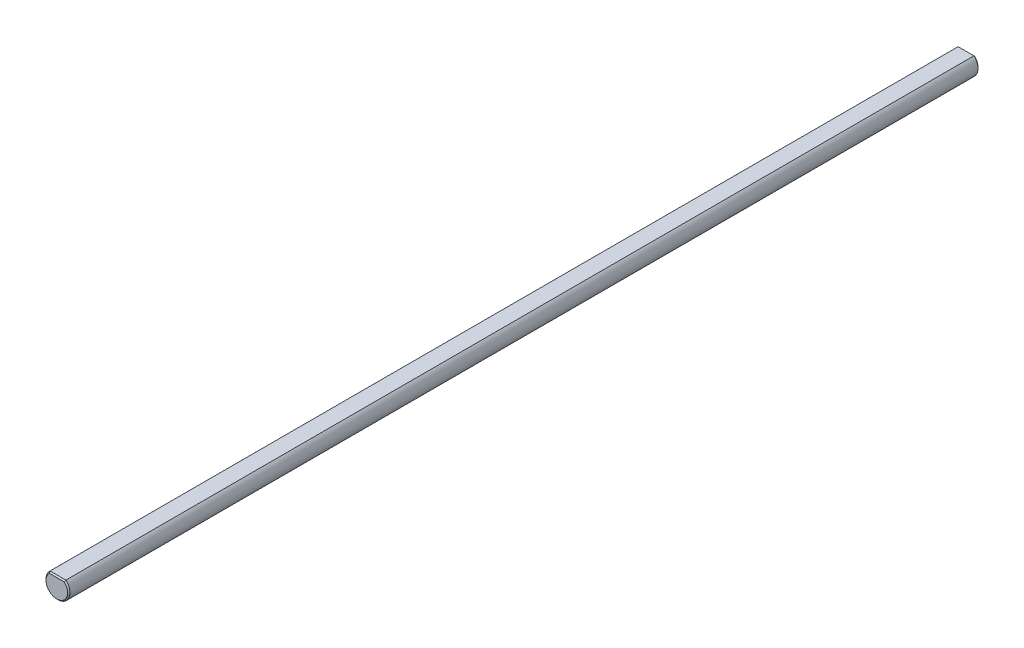
ISO-10303-21;
HEADER;
FILE_DESCRIPTION(('STEP AP214'),'2;1');
FILE_NAME('part.step','',(''),(''),'','','');
FILE_SCHEMA(('AUTOMOTIVE_DESIGN { 1 0 10303 214 1 1 1 1 }'));
ENDSEC;
DATA;
#1=APPLICATION_CONTEXT('core data for automotive mechanical design processes');
#2=APPLICATION_PROTOCOL_DEFINITION('international standard','automotive_design',2000,#1);
#3=PRODUCT_CONTEXT('',#1,'mechanical');
#4=PRODUCT('Part','Part','',(#3));
#5=PRODUCT_RELATED_PRODUCT_CATEGORY('part','',(#4));
#6=PRODUCT_DEFINITION_FORMATION('','',#4);
#7=PRODUCT_DEFINITION_CONTEXT('part definition',#1,'design');
#8=PRODUCT_DEFINITION('design','',#6,#7);
#9=PRODUCT_DEFINITION_SHAPE('','',#8);
#10=(LENGTH_UNIT() NAMED_UNIT(*) SI_UNIT(.MILLI.,.METRE.));
#11=(NAMED_UNIT(*) PLANE_ANGLE_UNIT() SI_UNIT($,.RADIAN.));
#12=(NAMED_UNIT(*) SI_UNIT($,.STERADIAN.) SOLID_ANGLE_UNIT());
#13=UNCERTAINTY_MEASURE_WITH_UNIT(LENGTH_MEASURE(1.E-05),#10,'distance_accuracy_value','');
#14=(GEOMETRIC_REPRESENTATION_CONTEXT(3) GLOBAL_UNCERTAINTY_ASSIGNED_CONTEXT((#13)) GLOBAL_UNIT_ASSIGNED_CONTEXT((#10,
#11,#12)) REPRESENTATION_CONTEXT('',''));
#15=CARTESIAN_POINT('',(0.,0.,0.));
#16=DIRECTION('',(0.,0.,1.));
#17=DIRECTION('',(1.,0.,0.));
#18=AXIS2_PLACEMENT_3D('',#15,#16,#17);
#19=CARTESIAN_POINT('',(0.,1.5,151.8));
#20=DIRECTION('',(0.,-0.707106781186597,-0.707106781186499));
#21=DIRECTION('',(0.,0.707106781186499,-0.707106781186597));
#22=AXIS2_PLACEMENT_3D('',#19,#20,#21);
#23=PLANE('',#22);
#24=CARTESIAN_POINT('',(-1.24498995978677,1.30000000000683,151.999999999993));
#25=CARTESIAN_POINT('',(-1.25833682018426,1.33326211367395,151.966737886326));
#26=CARTESIAN_POINT('',(-1.27150073002902,1.36655985041835,151.933440149582));
#27=CARTESIAN_POINT('',(-1.2974626280238,1.43322651719116,151.866773482809));
#28=CARTESIAN_POINT('',(-1.31026061675417,1.46659544710657,151.833404552893));
#29=CARTESIAN_POINT('',(-1.32287565551219,1.49999999998626,151.800000000014));
#30=B_SPLINE_CURVE_WITH_KNOTS('',3,(#24,#25,#26,#27,#28,#29),.UNSPECIFIED.,.F.,.F.,(4,2,4),(0.,
0.146686412468909,0.293372592276294),.UNSPECIFIED.);
#31=CARTESIAN_POINT('',(-1.24498995979528,1.29999999999835,151.999999999993));
#32=VERTEX_POINT('',#31);
#33=CARTESIAN_POINT('',(-1.32287565551915,1.49999999999443,151.800000000004));
#34=VERTEX_POINT('',#33);
#35=EDGE_CURVE('E62',#32,#34,#30,.T.);
#36=ORIENTED_EDGE('',*,*,#35,.F.);
#37=DIRECTION('',(1.,0.,0.));
#38=VECTOR('',#37,1.);
#39=CARTESIAN_POINT('',(0.,1.29999999999835,152.));
#40=LINE('',#39,#38);
#41=CARTESIAN_POINT('',(1.24498995979579,1.30000000000259,151.99999999999));
#42=VERTEX_POINT('',#41);
#43=EDGE_CURVE('E74',#42,#32,#40,.F.);
#44=ORIENTED_EDGE('',*,*,#43,.F.);
#45=CARTESIAN_POINT('',(1.32287565551172,1.49999999998654,151.800000000013));
#46=CARTESIAN_POINT('',(1.31026061675389,1.46659544710678,151.833404552893));
#47=CARTESIAN_POINT('',(1.29746262802368,1.4332265171913,151.866773482809));
#48=CARTESIAN_POINT('',(1.27150073002919,1.36655985041837,151.933440149582));
#49=CARTESIAN_POINT('',(1.25833682018456,1.33326211367391,151.966737886326));
#50=CARTESIAN_POINT('',(1.24498995978719,1.30000000000674,151.999999999993));
#51=B_SPLINE_CURVE_WITH_KNOTS('',3,(#45,#46,#47,#48,#49,#50),.UNSPECIFIED.,.F.,.F.,(4,2,4),(0.,
0.146686179807521,0.293372592276554),.UNSPECIFIED.);
#52=CARTESIAN_POINT('',(1.32287565552245,1.49999999999307,151.800000000004));
#53=VERTEX_POINT('',#52);
#54=EDGE_CURVE('E21',#53,#42,#51,.T.);
#55=ORIENTED_EDGE('',*,*,#54,.F.);
#56=DIRECTION('',(1.,0.,0.));
#57=VECTOR('',#56,1.);
#58=CARTESIAN_POINT('',(0.,1.5,151.799999999995));
#59=LINE('',#58,#57);
#60=EDGE_CURVE('E72',#34,#53,#59,.T.);
#61=ORIENTED_EDGE('',*,*,#60,.F.);
#62=EDGE_LOOP('',(#36,#44,#55,#61));
#63=FACE_BOUND('',#62,.T.);
#64=ADVANCED_FACE('F17',(#63),#23,.F.);
#65=CARTESIAN_POINT('',(0.,1.30000000000001,0.));
#66=DIRECTION('',(0.,0.707106781186572,-0.707106781186523));
#67=DIRECTION('',(0.,0.707106781186523,0.707106781186572));
#68=AXIS2_PLACEMENT_3D('',#65,#66,#67);
#69=PLANE('',#68);
#70=CARTESIAN_POINT('',(1.24498995980252,1.29999999999865,-1.36273829544672E-12));
#71=CARTESIAN_POINT('',(1.25833682021523,1.33326211366918,0.0332621136691727));
#72=CARTESIAN_POINT('',(1.27150073007549,1.36655985041698,0.0665598504169746));
#73=CARTESIAN_POINT('',(1.29746262810182,1.43322651719657,0.133226517196568));
#74=CARTESIAN_POINT('',(1.31026061684826,1.46659544711535,0.166595447115354));
#75=CARTESIAN_POINT('',(1.3228756556226,1.4999999999984,0.199999999998403));
#76=B_SPLINE_CURVE_WITH_KNOTS('',3,(#70,#71,#72,#73,#74,#75),.UNSPECIFIED.,.F.,.F.,(4,2,4),(0.,
0.146686412495317,0.293372592329109),.UNSPECIFIED.);
#77=CARTESIAN_POINT('',(1.24498995980554,1.2999999999967,-6.81379102545471E-13));
#78=VERTEX_POINT('',#77);
#79=CARTESIAN_POINT('',(1.32287565557843,1.5,0.200000000000644));
#80=VERTEX_POINT('',#79);
#81=EDGE_CURVE('E75',#78,#80,#76,.T.);
#82=ORIENTED_EDGE('',*,*,#81,.F.);
#83=DIRECTION('',(1.,0.,0.));
#84=VECTOR('',#83,1.);
#85=CARTESIAN_POINT('',(0.,1.29999999999476,0.));
#86=LINE('',#85,#84);
#87=CARTESIAN_POINT('',(-1.24498995980554,1.2999999999967,-6.81248701145592E-13));
#88=VERTEX_POINT('',#87);
#89=EDGE_CURVE('E87',#78,#88,#86,.F.);
#90=ORIENTED_EDGE('',*,*,#89,.T.);
#91=CARTESIAN_POINT('',(-1.32287565562208,1.49999999999851,0.199999999998518));
#92=CARTESIAN_POINT('',(-1.31026061684793,1.46659544711543,0.16659544711543));
#93=CARTESIAN_POINT('',(-1.29746262810167,1.43322651719661,0.133226517196608));
#94=CARTESIAN_POINT('',(-1.27150073007565,1.36655985041695,0.0665598504169501));
#95=CARTESIAN_POINT('',(-1.25833682021553,1.33326211366913,0.0332621136691195));
#96=CARTESIAN_POINT('',(-1.24498995980294,1.29999999999857,-1.44157768070752E-12));
#97=B_SPLINE_CURVE_WITH_KNOTS('',3,(#91,#92,#93,#94,#95,#96),.UNSPECIFIED.,.F.,.F.,(4,2,4),(0.,
0.146686179833801,0.293372592329124),.UNSPECIFIED.);
#98=CARTESIAN_POINT('',(-1.32287565557436,1.50000000000175,0.199999999999845));
#99=VERTEX_POINT('',#98);
#100=EDGE_CURVE('E91',#99,#88,#97,.T.);
#101=ORIENTED_EDGE('',*,*,#100,.F.);
#102=DIRECTION('',(1.,0.,0.));
#103=VECTOR('',#102,1.);
#104=CARTESIAN_POINT('',(0.,1.5,0.200000000001282));
#105=LINE('',#104,#103);
#106=EDGE_CURVE('E82',#80,#99,#105,.F.);
#107=ORIENTED_EDGE('',*,*,#106,.F.);
#108=EDGE_LOOP('',(#82,#90,#101,#107));
#109=FACE_BOUND('',#108,.T.);
#110=ADVANCED_FACE('F110',(#109),#69,.T.);
#111=CARTESIAN_POINT('',(0.,0.,152.));
#112=DIRECTION('',(0.,0.,1.));
#113=DIRECTION('',(1.,0.,0.));
#114=AXIS2_PLACEMENT_3D('',#111,#112,#113);
#115=PLANE('',#114);
#116=ORIENTED_EDGE('',*,*,#43,.T.);
#117=CARTESIAN_POINT('',(0.,0.,151.999999999987));
#118=DIRECTION('',(0.,0.,-1.));
#119=DIRECTION('',(-1.,0.,0.));
#120=AXIS2_PLACEMENT_3D('',#117,#118,#119);
#121=CIRCLE('',#120,1.80000000000291);
#122=EDGE_CURVE('E86',#42,#32,#121,.T.);
#123=ORIENTED_EDGE('',*,*,#122,.F.);
#124=EDGE_LOOP('',(#116,#123));
#125=FACE_BOUND('',#124,.T.);
#126=ADVANCED_FACE('F114',(#125),#115,.T.);
#127=CARTESIAN_POINT('',(0.,1.5,152.));
#128=DIRECTION('',(0.,1.,0.));
#129=DIRECTION('',(0.,0.,1.));
#130=AXIS2_PLACEMENT_3D('',#127,#128,#129);
#131=PLANE('',#130);
#132=DIRECTION('',(0.,0.,-1.));
#133=VECTOR('',#132,1.);
#134=CARTESIAN_POINT('',(1.32287565553318,1.49999999999922,152.));
#135=LINE('',#134,#133);
#136=EDGE_CURVE('E80',#80,#53,#135,.F.);
#137=ORIENTED_EDGE('',*,*,#136,.F.);
#138=ORIENTED_EDGE('',*,*,#106,.T.);
#139=DIRECTION('',(0.,0.,-1.));
#140=VECTOR('',#139,1.);
#141=CARTESIAN_POINT('',(-1.32287565552664,1.50000000000499,152.));
#142=LINE('',#141,#140);
#143=EDGE_CURVE('E81',#34,#99,#142,.T.);
#144=ORIENTED_EDGE('',*,*,#143,.F.);
#145=ORIENTED_EDGE('',*,*,#60,.T.);
#146=EDGE_LOOP('',(#137,#138,#144,#145));
#147=FACE_BOUND('',#146,.T.);
#148=ADVANCED_FACE('F78',(#147),#131,.T.);
#149=CARTESIAN_POINT('',(0.,0.,0.));
#150=DIRECTION('',(0.,0.,1.));
#151=DIRECTION('',(1.,0.,0.));
#152=AXIS2_PLACEMENT_3D('',#149,#150,#151);
#153=PLANE('',#152);
#154=ORIENTED_EDGE('',*,*,#89,.F.);
#155=CARTESIAN_POINT('',(0.,0.,0.));
#156=DIRECTION('',(0.,0.,1.));
#157=DIRECTION('',(1.,0.,0.));
#158=AXIS2_PLACEMENT_3D('',#155,#156,#157);
#159=CIRCLE('',#158,1.80000000000291);
#160=EDGE_CURVE('E68',#88,#78,#159,.T.);
#161=ORIENTED_EDGE('',*,*,#160,.F.);
#162=EDGE_LOOP('',(#154,#161));
#163=FACE_BOUND('',#162,.T.);
#164=ADVANCED_FACE('F129',(#163),#153,.F.);
#165=CARTESIAN_POINT('',(0.,0.,151.800000000094));
#166=DIRECTION('',(0.,0.,-1.));
#167=DIRECTION('',(-1.,0.,0.));
#168=AXIS2_PLACEMENT_3D('',#165,#166,#167);
#169=CONICAL_SURFACE('',#168,1.99999999989586,0.785398163397448);
#170=ORIENTED_EDGE('',*,*,#122,.T.);
#171=ORIENTED_EDGE('',*,*,#35,.T.);
#172=CARTESIAN_POINT('',(0.,0.,151.8));
#173=DIRECTION('',(0.,0.,-1.));
#174=DIRECTION('',(-1.,0.,0.));
#175=AXIS2_PLACEMENT_3D('',#172,#173,#174);
#176=CIRCLE('',#175,2.);
#177=EDGE_CURVE('E31',#53,#34,#176,.T.);
#178=ORIENTED_EDGE('',*,*,#177,.F.);
#179=ORIENTED_EDGE('',*,*,#54,.T.);
#180=EDGE_LOOP('',(#170,#171,#178,#179));
#181=FACE_BOUND('',#180,.T.);
#182=ADVANCED_FACE('F59',(#181),#169,.T.);
#183=CARTESIAN_POINT('',(0.,0.,0.200000000006639));
#184=DIRECTION('',(0.,0.,1.));
#185=DIRECTION('',(1.,0.,0.));
#186=AXIS2_PLACEMENT_3D('',#183,#184,#185);
#187=CONICAL_SURFACE('',#186,2.00000000006639,0.785398163539557);
#188=ORIENTED_EDGE('',*,*,#160,.T.);
#189=ORIENTED_EDGE('',*,*,#81,.T.);
#190=CARTESIAN_POINT('',(0.,0.,0.200000000000006));
#191=DIRECTION('',(0.,0.,-1.));
#192=DIRECTION('',(-1.,0.,0.));
#193=AXIS2_PLACEMENT_3D('',#190,#191,#192);
#194=CIRCLE('',#193,2.);
#195=EDGE_CURVE('E10',#99,#80,#194,.F.);
#196=ORIENTED_EDGE('',*,*,#195,.F.);
#197=ORIENTED_EDGE('',*,*,#100,.T.);
#198=EDGE_LOOP('',(#188,#189,#196,#197));
#199=FACE_BOUND('',#198,.T.);
#200=ADVANCED_FACE('F107',(#199),#187,.T.);
#201=CARTESIAN_POINT('',(0.,0.,152.));
#202=DIRECTION('',(0.,0.,-1.));
#203=DIRECTION('',(-1.,0.,0.));
#204=AXIS2_PLACEMENT_3D('',#201,#202,#203);
#205=CYLINDRICAL_SURFACE('',#204,2.);
#206=ORIENTED_EDGE('',*,*,#177,.T.);
#207=ORIENTED_EDGE('',*,*,#143,.T.);
#208=ORIENTED_EDGE('',*,*,#195,.T.);
#209=ORIENTED_EDGE('',*,*,#136,.T.);
#210=EDGE_LOOP('',(#206,#207,#208,#209));
#211=FACE_BOUND('',#210,.T.);
#212=ADVANCED_FACE('F84',(#211),#205,.T.);
#213=CLOSED_SHELL('',(#64,#110,#126,#148,#164,#182,#200,#212));
#214=MANIFOLD_SOLID_BREP('B1',#213);
#215=ADVANCED_BREP_SHAPE_REPRESENTATION('',(#18,#214),#14);
#216=SHAPE_DEFINITION_REPRESENTATION(#9,#215);
ENDSEC;
END-ISO-10303-21;
